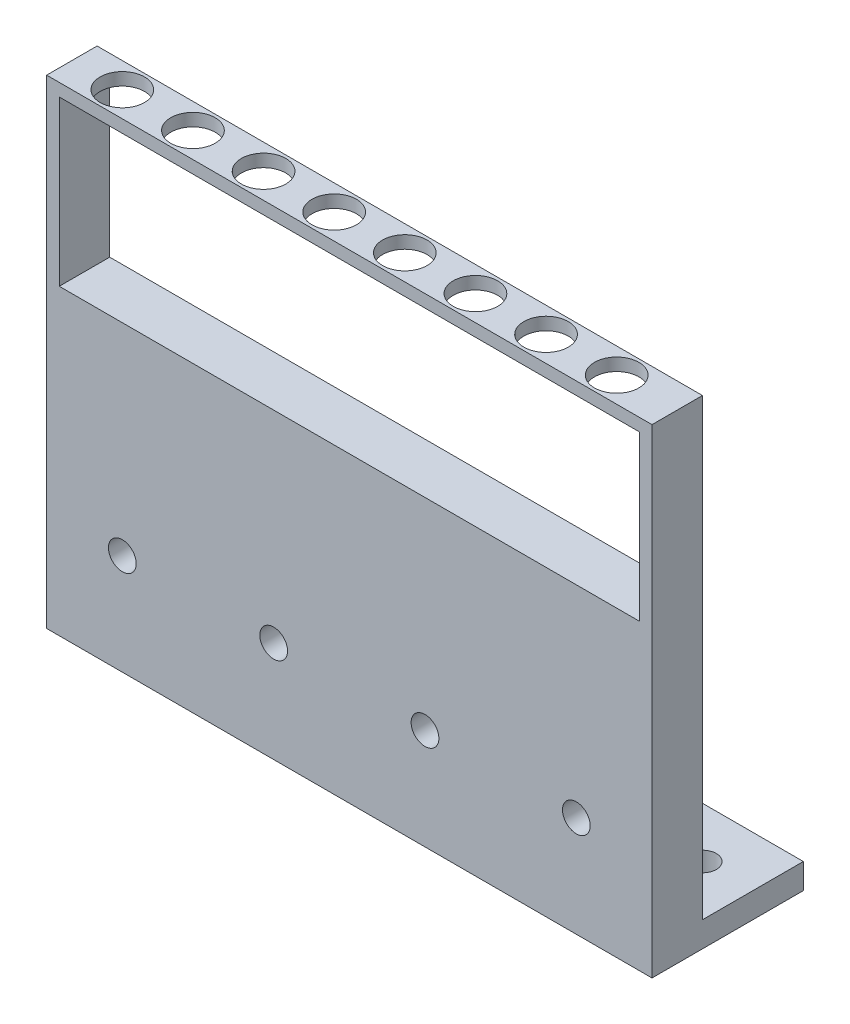
ISO-10303-21;
HEADER;
FILE_DESCRIPTION(('STEP AP214'),'2;1');
FILE_NAME('part.step','',(''),(''),'','','');
FILE_SCHEMA(('AUTOMOTIVE_DESIGN { 1 0 10303 214 1 1 1 1 }'));
ENDSEC;
DATA;
#1=APPLICATION_CONTEXT('core data for automotive mechanical design processes');
#2=APPLICATION_PROTOCOL_DEFINITION('international standard','automotive_design',2000,#1);
#3=PRODUCT_CONTEXT('',#1,'mechanical');
#4=PRODUCT('Part','Part','',(#3));
#5=PRODUCT_RELATED_PRODUCT_CATEGORY('part','',(#4));
#6=PRODUCT_DEFINITION_FORMATION('','',#4);
#7=PRODUCT_DEFINITION_CONTEXT('part definition',#1,'design');
#8=PRODUCT_DEFINITION('design','',#6,#7);
#9=PRODUCT_DEFINITION_SHAPE('','',#8);
#10=(LENGTH_UNIT() NAMED_UNIT(*) SI_UNIT(.MILLI.,.METRE.));
#11=(NAMED_UNIT(*) PLANE_ANGLE_UNIT() SI_UNIT($,.RADIAN.));
#12=(NAMED_UNIT(*) SI_UNIT($,.STERADIAN.) SOLID_ANGLE_UNIT());
#13=UNCERTAINTY_MEASURE_WITH_UNIT(LENGTH_MEASURE(1.E-05),#10,'distance_accuracy_value','');
#14=(GEOMETRIC_REPRESENTATION_CONTEXT(3) GLOBAL_UNCERTAINTY_ASSIGNED_CONTEXT((#13)) GLOBAL_UNIT_ASSIGNED_CONTEXT((#10,
#11,#12)) REPRESENTATION_CONTEXT('',''));
#15=CARTESIAN_POINT('',(0.,0.,0.));
#16=DIRECTION('',(0.,0.,1.));
#17=DIRECTION('',(1.,0.,0.));
#18=AXIS2_PLACEMENT_3D('',#15,#16,#17);
#19=CARTESIAN_POINT('',(-76.2,76.2,-6.35));
#20=DIRECTION('',(0.,0.,1.));
#21=DIRECTION('',(1.,0.,0.));
#22=AXIS2_PLACEMENT_3D('',#19,#20,#21);
#23=PLANE('',#22);
#24=CARTESIAN_POINT('',(19.05,25.4,-6.35));
#25=DIRECTION('',(0.,0.,-1.));
#26=DIRECTION('',(-1.,0.,0.));
#27=AXIS2_PLACEMENT_3D('',#24,#25,#26);
#28=CIRCLE('',#27,3.49250000000001);
#29=CARTESIAN_POINT('',(15.5575,25.4,-6.35));
#30=VERTEX_POINT('',#29);
#31=EDGE_CURVE('E321',#30,#30,#28,.T.);
#32=ORIENTED_EDGE('',*,*,#31,.F.);
#33=EDGE_LOOP('',(#32));
#34=FACE_BOUND('',#33,.T.);
#35=CARTESIAN_POINT('',(-19.05,25.4,-6.35));
#36=DIRECTION('',(0.,0.,-1.));
#37=DIRECTION('',(-1.,0.,0.));
#38=AXIS2_PLACEMENT_3D('',#35,#36,#37);
#39=CIRCLE('',#38,3.49250000000001);
#40=CARTESIAN_POINT('',(-22.5425,25.4,-6.35));
#41=VERTEX_POINT('',#40);
#42=EDGE_CURVE('E315',#41,#41,#39,.T.);
#43=ORIENTED_EDGE('',*,*,#42,.F.);
#44=EDGE_LOOP('',(#43));
#45=FACE_BOUND('',#44,.T.);
#46=CARTESIAN_POINT('',(-57.15,25.4,-6.35));
#47=DIRECTION('',(0.,0.,-1.));
#48=DIRECTION('',(-1.,0.,0.));
#49=AXIS2_PLACEMENT_3D('',#46,#47,#48);
#50=CIRCLE('',#49,3.49250000000001);
#51=CARTESIAN_POINT('',(-60.6425,25.4,-6.35));
#52=VERTEX_POINT('',#51);
#53=EDGE_CURVE('E309',#52,#52,#50,.T.);
#54=ORIENTED_EDGE('',*,*,#53,.F.);
#55=EDGE_LOOP('',(#54));
#56=FACE_BOUND('',#55,.T.);
#57=CARTESIAN_POINT('',(57.15,25.4,-6.35));
#58=DIRECTION('',(0.,0.,-1.));
#59=DIRECTION('',(-1.,0.,0.));
#60=AXIS2_PLACEMENT_3D('',#57,#58,#59);
#61=CIRCLE('',#60,3.49250000000001);
#62=CARTESIAN_POINT('',(53.6575,25.4,-6.35));
#63=VERTEX_POINT('',#62);
#64=EDGE_CURVE('E303',#63,#63,#61,.T.);
#65=ORIENTED_EDGE('',*,*,#64,.F.);
#66=EDGE_LOOP('',(#65));
#67=FACE_BOUND('',#66,.T.);
#68=DIRECTION('',(-1.,0.,0.));
#69=VECTOR('',#68,1.);
#70=CARTESIAN_POINT('',(-76.2,76.2,-6.35));
#71=LINE('',#70,#69);
#72=CARTESIAN_POINT('',(73.025,76.2,-6.34999999999999));
#73=VERTEX_POINT('',#72);
#74=CARTESIAN_POINT('',(-73.025,76.2,-6.35));
#75=VERTEX_POINT('',#74);
#76=EDGE_CURVE('E212',#73,#75,#71,.T.);
#77=ORIENTED_EDGE('',*,*,#76,.F.);
#78=DIRECTION('',(0.,1.,0.));
#79=VECTOR('',#78,1.);
#80=CARTESIAN_POINT('',(73.025,76.2,-6.34999999999999));
#81=LINE('',#80,#79);
#82=CARTESIAN_POINT('',(73.025,117.475,-6.34999999999999));
#83=VERTEX_POINT('',#82);
#84=EDGE_CURVE('E253',#73,#83,#81,.T.);
#85=ORIENTED_EDGE('',*,*,#84,.T.);
#86=DIRECTION('',(-1.,0.,0.));
#87=VECTOR('',#86,1.);
#88=CARTESIAN_POINT('',(73.025,117.475,-6.34999999999999));
#89=LINE('',#88,#87);
#90=CARTESIAN_POINT('',(-73.025,117.475,-6.34999999999999));
#91=VERTEX_POINT('',#90);
#92=EDGE_CURVE('E147',#83,#91,#89,.T.);
#93=ORIENTED_EDGE('',*,*,#92,.T.);
#94=DIRECTION('',(0.,-1.,0.));
#95=VECTOR('',#94,1.);
#96=CARTESIAN_POINT('',(-73.025,117.475,-6.34999999999999));
#97=LINE('',#96,#95);
#98=EDGE_CURVE('E115',#91,#75,#97,.T.);
#99=ORIENTED_EDGE('',*,*,#98,.T.);
#100=EDGE_LOOP('',(#77,#85,#93,#99));
#101=FACE_BOUND('',#100,.T.);
#102=DIRECTION('',(1.,0.,0.));
#103=VECTOR('',#102,1.);
#104=CARTESIAN_POINT('',(-76.2,6.35,-6.35));
#105=LINE('',#104,#103);
#106=CARTESIAN_POINT('',(-76.2,6.35000000000002,-6.35));
#107=VERTEX_POINT('',#106);
#108=CARTESIAN_POINT('',(76.2,6.35,-6.35));
#109=VERTEX_POINT('',#108);
#110=EDGE_CURVE('E196',#107,#109,#105,.T.);
#111=ORIENTED_EDGE('',*,*,#110,.F.);
#112=DIRECTION('',(0.,-1.,0.));
#113=VECTOR('',#112,1.);
#114=CARTESIAN_POINT('',(-76.2,76.2,-6.35));
#115=LINE('',#114,#113);
#116=CARTESIAN_POINT('',(-76.2,120.65,-6.34999999999999));
#117=VERTEX_POINT('',#116);
#118=EDGE_CURVE('E41',#117,#107,#115,.T.);
#119=ORIENTED_EDGE('',*,*,#118,.F.);
#120=DIRECTION('',(1.,0.,0.));
#121=VECTOR('',#120,1.);
#122=CARTESIAN_POINT('',(-76.2,120.65,-6.34999999999999));
#123=LINE('',#122,#121);
#124=CARTESIAN_POINT('',(76.2,120.65,-6.34999999999999));
#125=VERTEX_POINT('',#124);
#126=EDGE_CURVE('E137',#117,#125,#123,.T.);
#127=ORIENTED_EDGE('',*,*,#126,.T.);
#128=DIRECTION('',(0.,-1.,0.));
#129=VECTOR('',#128,1.);
#130=CARTESIAN_POINT('',(76.2,76.2,-6.35));
#131=LINE('',#130,#129);
#132=EDGE_CURVE('E11',#125,#109,#131,.T.);
#133=ORIENTED_EDGE('',*,*,#132,.T.);
#134=EDGE_LOOP('',(#111,#119,#127,#133));
#135=FACE_BOUND('',#134,.T.);
#136=ADVANCED_FACE('F33',(#34,#45,#56,#67,#101,#135),#23,.F.);
#137=CARTESIAN_POINT('',(76.2,76.2,6.35));
#138=DIRECTION('',(-1.,0.,0.));
#139=DIRECTION('',(0.,0.,1.));
#140=AXIS2_PLACEMENT_3D('',#137,#138,#139);
#141=PLANE('',#140);
#142=DIRECTION('',(0.,0.,-1.));
#143=VECTOR('',#142,1.);
#144=CARTESIAN_POINT('',(76.2,0.,6.35));
#145=LINE('',#144,#143);
#146=CARTESIAN_POINT('',(76.2,0.,6.35));
#147=VERTEX_POINT('',#146);
#148=CARTESIAN_POINT('',(76.2,0.,-31.75));
#149=VERTEX_POINT('',#148);
#150=EDGE_CURVE('E211',#147,#149,#145,.T.);
#151=ORIENTED_EDGE('',*,*,#150,.T.);
#152=DIRECTION('',(0.,-1.,0.));
#153=VECTOR('',#152,1.);
#154=CARTESIAN_POINT('',(76.2,6.35,-31.75));
#155=LINE('',#154,#153);
#156=CARTESIAN_POINT('',(76.2,6.35,-31.75));
#157=VERTEX_POINT('',#156);
#158=EDGE_CURVE('E208',#157,#149,#155,.T.);
#159=ORIENTED_EDGE('',*,*,#158,.F.);
#160=DIRECTION('',(0.,0.,-1.));
#161=VECTOR('',#160,1.);
#162=CARTESIAN_POINT('',(76.2,6.35,-6.35));
#163=LINE('',#162,#161);
#164=EDGE_CURVE('E199',#109,#157,#163,.T.);
#165=ORIENTED_EDGE('',*,*,#164,.F.);
#166=ORIENTED_EDGE('',*,*,#132,.F.);
#167=DIRECTION('',(0.,0.,1.));
#168=VECTOR('',#167,1.);
#169=CARTESIAN_POINT('',(76.2,120.65,-165.1));
#170=LINE('',#169,#168);
#171=CARTESIAN_POINT('',(76.2,120.65,6.35));
#172=VERTEX_POINT('',#171);
#173=EDGE_CURVE('E148',#125,#172,#170,.T.);
#174=ORIENTED_EDGE('',*,*,#173,.T.);
#175=DIRECTION('',(0.,-1.,0.));
#176=VECTOR('',#175,1.);
#177=CARTESIAN_POINT('',(76.2,76.2,6.35));
#178=LINE('',#177,#176);
#179=EDGE_CURVE('E216',#172,#147,#178,.T.);
#180=ORIENTED_EDGE('',*,*,#179,.T.);
#181=EDGE_LOOP('',(#151,#159,#165,#166,#174,#180));
#182=FACE_BOUND('',#181,.T.);
#183=ADVANCED_FACE('F35',(#182),#141,.F.);
#184=CARTESIAN_POINT('',(-76.2,76.2,6.35));
#185=DIRECTION('',(1.,0.,0.));
#186=DIRECTION('',(0.,0.,-1.));
#187=AXIS2_PLACEMENT_3D('',#184,#185,#186);
#188=PLANE('',#187);
#189=DIRECTION('',(0.,0.,1.));
#190=VECTOR('',#189,1.);
#191=CARTESIAN_POINT('',(-76.2,0.,6.35));
#192=LINE('',#191,#190);
#193=CARTESIAN_POINT('',(-76.2,0.,-31.75));
#194=VERTEX_POINT('',#193);
#195=CARTESIAN_POINT('',(-76.2,0.,6.35));
#196=VERTEX_POINT('',#195);
#197=EDGE_CURVE('E218',#194,#196,#192,.T.);
#198=ORIENTED_EDGE('',*,*,#197,.T.);
#199=DIRECTION('',(0.,-1.,0.));
#200=VECTOR('',#199,1.);
#201=CARTESIAN_POINT('',(-76.2,76.2,6.35));
#202=LINE('',#201,#200);
#203=CARTESIAN_POINT('',(-76.2,120.65,6.35));
#204=VERTEX_POINT('',#203);
#205=EDGE_CURVE('E223',#204,#196,#202,.T.);
#206=ORIENTED_EDGE('',*,*,#205,.F.);
#207=DIRECTION('',(0.,0.,1.));
#208=VECTOR('',#207,1.);
#209=CARTESIAN_POINT('',(-76.2,120.65,-165.1));
#210=LINE('',#209,#208);
#211=EDGE_CURVE('E144',#117,#204,#210,.T.);
#212=ORIENTED_EDGE('',*,*,#211,.F.);
#213=ORIENTED_EDGE('',*,*,#118,.T.);
#214=DIRECTION('',(0.,0.,1.));
#215=VECTOR('',#214,1.);
#216=CARTESIAN_POINT('',(-76.2,6.35,-19.05));
#217=LINE('',#216,#215);
#218=CARTESIAN_POINT('',(-76.2,6.35,-31.75));
#219=VERTEX_POINT('',#218);
#220=EDGE_CURVE('E193',#219,#107,#217,.T.);
#221=ORIENTED_EDGE('',*,*,#220,.F.);
#222=DIRECTION('',(0.,-1.,0.));
#223=VECTOR('',#222,1.);
#224=CARTESIAN_POINT('',(-76.2,6.35,-31.75));
#225=LINE('',#224,#223);
#226=EDGE_CURVE('E203',#219,#194,#225,.T.);
#227=ORIENTED_EDGE('',*,*,#226,.T.);
#228=EDGE_LOOP('',(#198,#206,#212,#213,#221,#227));
#229=FACE_BOUND('',#228,.T.);
#230=ADVANCED_FACE('F229',(#229),#188,.F.);
#231=CARTESIAN_POINT('',(-76.2,76.2,6.35));
#232=DIRECTION('',(0.,0.,-1.));
#233=DIRECTION('',(-1.,0.,0.));
#234=AXIS2_PLACEMENT_3D('',#231,#232,#233);
#235=PLANE('',#234);
#236=CARTESIAN_POINT('',(19.05,25.4,6.35));
#237=DIRECTION('',(0.,0.,-1.));
#238=DIRECTION('',(-1.,0.,0.));
#239=AXIS2_PLACEMENT_3D('',#236,#237,#238);
#240=CIRCLE('',#239,3.49250000000001);
#241=CARTESIAN_POINT('',(15.5575,25.4,6.35));
#242=VERTEX_POINT('',#241);
#243=EDGE_CURVE('E306',#242,#242,#240,.T.);
#244=ORIENTED_EDGE('',*,*,#243,.T.);
#245=EDGE_LOOP('',(#244));
#246=FACE_BOUND('',#245,.T.);
#247=CARTESIAN_POINT('',(-19.05,25.4,6.35));
#248=DIRECTION('',(0.,0.,-1.));
#249=DIRECTION('',(-1.,0.,0.));
#250=AXIS2_PLACEMENT_3D('',#247,#248,#249);
#251=CIRCLE('',#250,3.49250000000001);
#252=CARTESIAN_POINT('',(-22.5425,25.4,6.35));
#253=VERTEX_POINT('',#252);
#254=EDGE_CURVE('E318',#253,#253,#251,.T.);
#255=ORIENTED_EDGE('',*,*,#254,.T.);
#256=EDGE_LOOP('',(#255));
#257=FACE_BOUND('',#256,.T.);
#258=CARTESIAN_POINT('',(-57.15,25.4,6.35));
#259=DIRECTION('',(0.,0.,-1.));
#260=DIRECTION('',(-1.,0.,0.));
#261=AXIS2_PLACEMENT_3D('',#258,#259,#260);
#262=CIRCLE('',#261,3.49250000000001);
#263=CARTESIAN_POINT('',(-60.6425,25.4,6.35));
#264=VERTEX_POINT('',#263);
#265=EDGE_CURVE('E312',#264,#264,#262,.T.);
#266=ORIENTED_EDGE('',*,*,#265,.T.);
#267=EDGE_LOOP('',(#266));
#268=FACE_BOUND('',#267,.T.);
#269=CARTESIAN_POINT('',(57.15,25.4,6.35));
#270=DIRECTION('',(0.,0.,-1.));
#271=DIRECTION('',(-1.,0.,0.));
#272=AXIS2_PLACEMENT_3D('',#269,#270,#271);
#273=CIRCLE('',#272,3.49250000000001);
#274=CARTESIAN_POINT('',(53.6575,25.4,6.35));
#275=VERTEX_POINT('',#274);
#276=EDGE_CURVE('E265',#275,#275,#273,.T.);
#277=ORIENTED_EDGE('',*,*,#276,.T.);
#278=EDGE_LOOP('',(#277));
#279=FACE_BOUND('',#278,.T.);
#280=DIRECTION('',(1.,0.,0.));
#281=VECTOR('',#280,1.);
#282=CARTESIAN_POINT('',(-76.2,76.2,6.35));
#283=LINE('',#282,#281);
#284=CARTESIAN_POINT('',(-73.025,76.2,6.35));
#285=VERTEX_POINT('',#284);
#286=CARTESIAN_POINT('',(73.025,76.2,6.35));
#287=VERTEX_POINT('',#286);
#288=EDGE_CURVE('E48',#285,#287,#283,.T.);
#289=ORIENTED_EDGE('',*,*,#288,.F.);
#290=DIRECTION('',(0.,1.,0.));
#291=VECTOR('',#290,1.);
#292=CARTESIAN_POINT('',(-73.025,117.475,6.35));
#293=LINE('',#292,#291);
#294=CARTESIAN_POINT('',(-73.025,117.475,6.35));
#295=VERTEX_POINT('',#294);
#296=EDGE_CURVE('E113',#285,#295,#293,.T.);
#297=ORIENTED_EDGE('',*,*,#296,.T.);
#298=DIRECTION('',(1.,0.,0.));
#299=VECTOR('',#298,1.);
#300=CARTESIAN_POINT('',(73.025,117.475,6.35));
#301=LINE('',#300,#299);
#302=CARTESIAN_POINT('',(73.025,117.475,6.35));
#303=VERTEX_POINT('',#302);
#304=EDGE_CURVE('E121',#295,#303,#301,.T.);
#305=ORIENTED_EDGE('',*,*,#304,.T.);
#306=DIRECTION('',(0.,-1.,0.));
#307=VECTOR('',#306,1.);
#308=CARTESIAN_POINT('',(73.025,76.2,6.35));
#309=LINE('',#308,#307);
#310=EDGE_CURVE('E127',#303,#287,#309,.T.);
#311=ORIENTED_EDGE('',*,*,#310,.T.);
#312=EDGE_LOOP('',(#289,#297,#305,#311));
#313=FACE_BOUND('',#312,.T.);
#314=DIRECTION('',(1.,0.,0.));
#315=VECTOR('',#314,1.);
#316=CARTESIAN_POINT('',(-76.2,0.,6.35));
#317=LINE('',#316,#315);
#318=EDGE_CURVE('E214',#196,#147,#317,.T.);
#319=ORIENTED_EDGE('',*,*,#318,.T.);
#320=ORIENTED_EDGE('',*,*,#179,.F.);
#321=DIRECTION('',(-1.,0.,0.));
#322=VECTOR('',#321,1.);
#323=CARTESIAN_POINT('',(-76.2,120.65,6.35));
#324=LINE('',#323,#322);
#325=EDGE_CURVE('E141',#172,#204,#324,.T.);
#326=ORIENTED_EDGE('',*,*,#325,.T.);
#327=ORIENTED_EDGE('',*,*,#205,.T.);
#328=EDGE_LOOP('',(#319,#320,#326,#327));
#329=FACE_BOUND('',#328,.T.);
#330=ADVANCED_FACE('F129',(#246,#257,#268,#279,#313,#329),#235,.F.);
#331=CARTESIAN_POINT('',(0.,76.2,0.));
#332=DIRECTION('',(0.,-1.,0.));
#333=DIRECTION('',(0.,0.,-1.));
#334=AXIS2_PLACEMENT_3D('',#331,#332,#333);
#335=PLANE('',#334);
#336=ORIENTED_EDGE('',*,*,#288,.T.);
#337=DIRECTION('',(0.,0.,1.));
#338=VECTOR('',#337,1.);
#339=CARTESIAN_POINT('',(73.025,76.2,-165.1));
#340=LINE('',#339,#338);
#341=EDGE_CURVE('E151',#73,#287,#340,.T.);
#342=ORIENTED_EDGE('',*,*,#341,.F.);
#343=ORIENTED_EDGE('',*,*,#76,.T.);
#344=DIRECTION('',(0.,0.,1.));
#345=VECTOR('',#344,1.);
#346=CARTESIAN_POINT('',(-73.025,76.2,-165.1));
#347=LINE('',#346,#345);
#348=EDGE_CURVE('E53',#75,#285,#347,.T.);
#349=ORIENTED_EDGE('',*,*,#348,.T.);
#350=EDGE_LOOP('',(#336,#342,#343,#349));
#351=FACE_BOUND('',#350,.T.);
#352=ADVANCED_FACE('F343',(#351),#335,.F.);
#353=CARTESIAN_POINT('',(0.,0.,0.));
#354=DIRECTION('',(0.,-1.,0.));
#355=DIRECTION('',(0.,0.,-1.));
#356=AXIS2_PLACEMENT_3D('',#353,#354,#355);
#357=PLANE('',#356);
#358=ORIENTED_EDGE('',*,*,#150,.F.);
#359=ORIENTED_EDGE('',*,*,#318,.F.);
#360=ORIENTED_EDGE('',*,*,#197,.F.);
#361=DIRECTION('',(-1.,0.,0.));
#362=VECTOR('',#361,1.);
#363=CARTESIAN_POINT('',(76.2,0.,-31.75));
#364=LINE('',#363,#362);
#365=EDGE_CURVE('E190',#149,#194,#364,.T.);
#366=ORIENTED_EDGE('',*,*,#365,.F.);
#367=EDGE_LOOP('',(#358,#359,#360,#366));
#368=FACE_BOUND('',#367,.T.);
#369=CARTESIAN_POINT('',(-63.5,0.,-19.05));
#370=DIRECTION('',(0.,1.,0.));
#371=DIRECTION('',(0.,0.,1.));
#372=AXIS2_PLACEMENT_3D('',#369,#370,#371);
#373=CIRCLE('',#372,3.4925);
#374=CARTESIAN_POINT('',(-63.5,0.,-15.5575));
#375=VERTEX_POINT('',#374);
#376=EDGE_CURVE('E184',#375,#375,#373,.T.);
#377=ORIENTED_EDGE('',*,*,#376,.T.);
#378=EDGE_LOOP('',(#377));
#379=FACE_BOUND('',#378,.T.);
#380=CARTESIAN_POINT('',(-38.1,0.,-19.05));
#381=DIRECTION('',(0.,1.,0.));
#382=DIRECTION('',(0.,0.,1.));
#383=AXIS2_PLACEMENT_3D('',#380,#381,#382);
#384=CIRCLE('',#383,3.49250000000001);
#385=CARTESIAN_POINT('',(-38.1,0.,-15.5575));
#386=VERTEX_POINT('',#385);
#387=EDGE_CURVE('E178',#386,#386,#384,.T.);
#388=ORIENTED_EDGE('',*,*,#387,.T.);
#389=EDGE_LOOP('',(#388));
#390=FACE_BOUND('',#389,.T.);
#391=CARTESIAN_POINT('',(-12.7,0.,-19.05));
#392=DIRECTION('',(0.,1.,0.));
#393=DIRECTION('',(0.,0.,1.));
#394=AXIS2_PLACEMENT_3D('',#391,#392,#393);
#395=CIRCLE('',#394,3.4925);
#396=CARTESIAN_POINT('',(-12.7,0.,-15.5575));
#397=VERTEX_POINT('',#396);
#398=EDGE_CURVE('E172',#397,#397,#395,.T.);
#399=ORIENTED_EDGE('',*,*,#398,.T.);
#400=EDGE_LOOP('',(#399));
#401=FACE_BOUND('',#400,.T.);
#402=CARTESIAN_POINT('',(12.6999999999999,0.,-19.05));
#403=DIRECTION('',(0.,1.,0.));
#404=DIRECTION('',(0.,0.,1.));
#405=AXIS2_PLACEMENT_3D('',#402,#403,#404);
#406=CIRCLE('',#405,3.4925);
#407=CARTESIAN_POINT('',(12.6999999999999,0.,-15.5575));
#408=VERTEX_POINT('',#407);
#409=EDGE_CURVE('E166',#408,#408,#406,.T.);
#410=ORIENTED_EDGE('',*,*,#409,.T.);
#411=EDGE_LOOP('',(#410));
#412=FACE_BOUND('',#411,.T.);
#413=CARTESIAN_POINT('',(38.0999999999999,0.,-19.05));
#414=DIRECTION('',(0.,1.,0.));
#415=DIRECTION('',(0.,0.,1.));
#416=AXIS2_PLACEMENT_3D('',#413,#414,#415);
#417=CIRCLE('',#416,3.49250000000001);
#418=CARTESIAN_POINT('',(38.0999999999999,0.,-15.5575));
#419=VERTEX_POINT('',#418);
#420=EDGE_CURVE('E160',#419,#419,#417,.T.);
#421=ORIENTED_EDGE('',*,*,#420,.T.);
#422=EDGE_LOOP('',(#421));
#423=FACE_BOUND('',#422,.T.);
#424=CARTESIAN_POINT('',(63.4999999999999,0.,-19.05));
#425=DIRECTION('',(0.,1.,0.));
#426=DIRECTION('',(0.,0.,1.));
#427=AXIS2_PLACEMENT_3D('',#424,#425,#426);
#428=CIRCLE('',#427,3.49250000000001);
#429=CARTESIAN_POINT('',(63.4999999999999,0.,-15.5575));
#430=VERTEX_POINT('',#429);
#431=EDGE_CURVE('E156',#430,#430,#428,.T.);
#432=ORIENTED_EDGE('',*,*,#431,.T.);
#433=EDGE_LOOP('',(#432));
#434=FACE_BOUND('',#433,.T.);
#435=ADVANCED_FACE('F247',(#368,#379,#390,#401,#412,#423,#434),#357,.T.);
#436=CARTESIAN_POINT('',(0.,6.35,0.));
#437=DIRECTION('',(0.,1.,0.));
#438=DIRECTION('',(0.,0.,1.));
#439=AXIS2_PLACEMENT_3D('',#436,#437,#438);
#440=PLANE('',#439);
#441=CARTESIAN_POINT('',(38.0999999999999,6.35,-19.05));
#442=DIRECTION('',(0.,1.,0.));
#443=DIRECTION('',(0.,0.,1.));
#444=AXIS2_PLACEMENT_3D('',#441,#442,#443);
#445=CIRCLE('',#444,3.49250000000001);
#446=CARTESIAN_POINT('',(38.0999999999999,6.35,-15.5575));
#447=VERTEX_POINT('',#446);
#448=EDGE_CURVE('E163',#447,#447,#445,.T.);
#449=ORIENTED_EDGE('',*,*,#448,.F.);
#450=EDGE_LOOP('',(#449));
#451=FACE_BOUND('',#450,.T.);
#452=CARTESIAN_POINT('',(-12.7,6.35,-19.05));
#453=DIRECTION('',(0.,1.,0.));
#454=DIRECTION('',(0.,0.,1.));
#455=AXIS2_PLACEMENT_3D('',#452,#453,#454);
#456=CIRCLE('',#455,3.4925);
#457=CARTESIAN_POINT('',(-12.7,6.35,-15.5575));
#458=VERTEX_POINT('',#457);
#459=EDGE_CURVE('E175',#458,#458,#456,.T.);
#460=ORIENTED_EDGE('',*,*,#459,.F.);
#461=EDGE_LOOP('',(#460));
#462=FACE_BOUND('',#461,.T.);
#463=CARTESIAN_POINT('',(-63.5,6.35,-19.05));
#464=DIRECTION('',(0.,1.,0.));
#465=DIRECTION('',(0.,0.,1.));
#466=AXIS2_PLACEMENT_3D('',#463,#464,#465);
#467=CIRCLE('',#466,3.4925);
#468=CARTESIAN_POINT('',(-63.5,6.35,-15.5575));
#469=VERTEX_POINT('',#468);
#470=EDGE_CURVE('E187',#469,#469,#467,.T.);
#471=ORIENTED_EDGE('',*,*,#470,.F.);
#472=EDGE_LOOP('',(#471));
#473=FACE_BOUND('',#472,.T.);
#474=ORIENTED_EDGE('',*,*,#220,.T.);
#475=ORIENTED_EDGE('',*,*,#110,.T.);
#476=ORIENTED_EDGE('',*,*,#164,.T.);
#477=DIRECTION('',(-1.,0.,0.));
#478=VECTOR('',#477,1.);
#479=CARTESIAN_POINT('',(76.2,6.35,-31.75));
#480=LINE('',#479,#478);
#481=EDGE_CURVE('E201',#157,#219,#480,.T.);
#482=ORIENTED_EDGE('',*,*,#481,.T.);
#483=EDGE_LOOP('',(#474,#475,#476,#482));
#484=FACE_BOUND('',#483,.T.);
#485=CARTESIAN_POINT('',(-38.1,6.35,-19.05));
#486=DIRECTION('',(0.,1.,0.));
#487=DIRECTION('',(0.,0.,1.));
#488=AXIS2_PLACEMENT_3D('',#485,#486,#487);
#489=CIRCLE('',#488,3.49250000000001);
#490=CARTESIAN_POINT('',(-38.1,6.35,-15.5575));
#491=VERTEX_POINT('',#490);
#492=EDGE_CURVE('E181',#491,#491,#489,.T.);
#493=ORIENTED_EDGE('',*,*,#492,.F.);
#494=EDGE_LOOP('',(#493));
#495=FACE_BOUND('',#494,.T.);
#496=CARTESIAN_POINT('',(12.6999999999999,6.35,-19.05));
#497=DIRECTION('',(0.,1.,0.));
#498=DIRECTION('',(0.,0.,1.));
#499=AXIS2_PLACEMENT_3D('',#496,#497,#498);
#500=CIRCLE('',#499,3.4925);
#501=CARTESIAN_POINT('',(12.6999999999999,6.35,-15.5575));
#502=VERTEX_POINT('',#501);
#503=EDGE_CURVE('E169',#502,#502,#500,.T.);
#504=ORIENTED_EDGE('',*,*,#503,.F.);
#505=EDGE_LOOP('',(#504));
#506=FACE_BOUND('',#505,.T.);
#507=CARTESIAN_POINT('',(63.4999999999999,6.35,-19.05));
#508=DIRECTION('',(0.,1.,0.));
#509=DIRECTION('',(0.,0.,1.));
#510=AXIS2_PLACEMENT_3D('',#507,#508,#509);
#511=CIRCLE('',#510,3.49250000000001);
#512=CARTESIAN_POINT('',(63.4999999999999,6.35,-15.5575));
#513=VERTEX_POINT('',#512);
#514=EDGE_CURVE('E157',#513,#513,#511,.T.);
#515=ORIENTED_EDGE('',*,*,#514,.F.);
#516=EDGE_LOOP('',(#515));
#517=FACE_BOUND('',#516,.T.);
#518=ADVANCED_FACE('F234',(#451,#462,#473,#484,#495,#506,#517),#440,.T.);
#519=CARTESIAN_POINT('',(76.2,6.35,-31.75));
#520=DIRECTION('',(0.,0.,1.));
#521=DIRECTION('',(1.,0.,0.));
#522=AXIS2_PLACEMENT_3D('',#519,#520,#521);
#523=PLANE('',#522);
#524=ORIENTED_EDGE('',*,*,#365,.T.);
#525=ORIENTED_EDGE('',*,*,#226,.F.);
#526=ORIENTED_EDGE('',*,*,#481,.F.);
#527=ORIENTED_EDGE('',*,*,#158,.T.);
#528=EDGE_LOOP('',(#524,#525,#526,#527));
#529=FACE_BOUND('',#528,.T.);
#530=ADVANCED_FACE('F241',(#529),#523,.F.);
#531=CARTESIAN_POINT('',(-63.5,6.35,-19.05));
#532=DIRECTION('',(0.,-1.,0.));
#533=DIRECTION('',(0.,0.,-1.));
#534=AXIS2_PLACEMENT_3D('',#531,#532,#533);
#535=CYLINDRICAL_SURFACE('',#534,3.4925);
#536=ORIENTED_EDGE('',*,*,#470,.T.);
#537=EDGE_LOOP('',(#536));
#538=FACE_BOUND('',#537,.T.);
#539=ORIENTED_EDGE('',*,*,#376,.F.);
#540=EDGE_LOOP('',(#539));
#541=FACE_BOUND('',#540,.T.);
#542=ADVANCED_FACE('F380',(#538,#541),#535,.F.);
#543=CARTESIAN_POINT('',(-38.1,6.35,-19.05));
#544=DIRECTION('',(0.,-1.,0.));
#545=DIRECTION('',(0.,0.,-1.));
#546=AXIS2_PLACEMENT_3D('',#543,#544,#545);
#547=CYLINDRICAL_SURFACE('',#546,3.49250000000001);
#548=ORIENTED_EDGE('',*,*,#492,.T.);
#549=EDGE_LOOP('',(#548));
#550=FACE_BOUND('',#549,.T.);
#551=ORIENTED_EDGE('',*,*,#387,.F.);
#552=EDGE_LOOP('',(#551));
#553=FACE_BOUND('',#552,.T.);
#554=ADVANCED_FACE('F376',(#550,#553),#547,.F.);
#555=CARTESIAN_POINT('',(-12.7,6.35,-19.05));
#556=DIRECTION('',(0.,-1.,0.));
#557=DIRECTION('',(0.,0.,-1.));
#558=AXIS2_PLACEMENT_3D('',#555,#556,#557);
#559=CYLINDRICAL_SURFACE('',#558,3.4925);
#560=ORIENTED_EDGE('',*,*,#459,.T.);
#561=EDGE_LOOP('',(#560));
#562=FACE_BOUND('',#561,.T.);
#563=ORIENTED_EDGE('',*,*,#398,.F.);
#564=EDGE_LOOP('',(#563));
#565=FACE_BOUND('',#564,.T.);
#566=ADVANCED_FACE('F372',(#562,#565),#559,.F.);
#567=CARTESIAN_POINT('',(12.6999999999999,6.35,-19.05));
#568=DIRECTION('',(0.,-1.,0.));
#569=DIRECTION('',(0.,0.,-1.));
#570=AXIS2_PLACEMENT_3D('',#567,#568,#569);
#571=CYLINDRICAL_SURFACE('',#570,3.4925);
#572=ORIENTED_EDGE('',*,*,#503,.T.);
#573=EDGE_LOOP('',(#572));
#574=FACE_BOUND('',#573,.T.);
#575=ORIENTED_EDGE('',*,*,#409,.F.);
#576=EDGE_LOOP('',(#575));
#577=FACE_BOUND('',#576,.T.);
#578=ADVANCED_FACE('F368',(#574,#577),#571,.F.);
#579=CARTESIAN_POINT('',(38.0999999999999,6.35,-19.05));
#580=DIRECTION('',(0.,-1.,0.));
#581=DIRECTION('',(0.,0.,-1.));
#582=AXIS2_PLACEMENT_3D('',#579,#580,#581);
#583=CYLINDRICAL_SURFACE('',#582,3.49250000000001);
#584=ORIENTED_EDGE('',*,*,#448,.T.);
#585=EDGE_LOOP('',(#584));
#586=FACE_BOUND('',#585,.T.);
#587=ORIENTED_EDGE('',*,*,#420,.F.);
#588=EDGE_LOOP('',(#587));
#589=FACE_BOUND('',#588,.T.);
#590=ADVANCED_FACE('F364',(#586,#589),#583,.F.);
#591=CARTESIAN_POINT('',(63.4999999999999,6.35,-19.05));
#592=DIRECTION('',(0.,-1.,0.));
#593=DIRECTION('',(0.,0.,-1.));
#594=AXIS2_PLACEMENT_3D('',#591,#592,#593);
#595=CYLINDRICAL_SURFACE('',#594,3.49250000000001);
#596=ORIENTED_EDGE('',*,*,#514,.T.);
#597=EDGE_LOOP('',(#596));
#598=FACE_BOUND('',#597,.T.);
#599=ORIENTED_EDGE('',*,*,#431,.F.);
#600=EDGE_LOOP('',(#599));
#601=FACE_BOUND('',#600,.T.);
#602=ADVANCED_FACE('F354',(#598,#601),#595,.F.);
#603=CARTESIAN_POINT('',(-76.2,120.65,-165.1));
#604=DIRECTION('',(0.,1.,0.));
#605=DIRECTION('',(0.,0.,1.));
#606=AXIS2_PLACEMENT_3D('',#603,#604,#605);
#607=PLANE('',#606);
#608=CARTESIAN_POINT('',(-45.72,120.65,0.));
#609=DIRECTION('',(0.,1.,0.));
#610=DIRECTION('',(0.,0.,1.));
#611=AXIS2_PLACEMENT_3D('',#608,#609,#610);
#612=CIRCLE('',#611,5.588);
#613=CARTESIAN_POINT('',(-45.72,120.65,5.588));
#614=VERTEX_POINT('',#613);
#615=EDGE_CURVE('E259',#614,#614,#612,.T.);
#616=ORIENTED_EDGE('',*,*,#615,.F.);
#617=EDGE_LOOP('',(#616));
#618=FACE_BOUND('',#617,.T.);
#619=CARTESIAN_POINT('',(-27.94,120.65,0.));
#620=DIRECTION('',(0.,1.,0.));
#621=DIRECTION('',(0.,0.,1.));
#622=AXIS2_PLACEMENT_3D('',#619,#620,#621);
#623=CIRCLE('',#622,5.588);
#624=CARTESIAN_POINT('',(-27.94,120.65,5.588));
#625=VERTEX_POINT('',#624);
#626=EDGE_CURVE('E295',#625,#625,#623,.T.);
#627=ORIENTED_EDGE('',*,*,#626,.F.);
#628=EDGE_LOOP('',(#627));
#629=FACE_BOUND('',#628,.T.);
#630=CARTESIAN_POINT('',(-10.16,120.65,0.));
#631=DIRECTION('',(0.,1.,0.));
#632=DIRECTION('',(0.,0.,1.));
#633=AXIS2_PLACEMENT_3D('',#630,#631,#632);
#634=CIRCLE('',#633,5.588);
#635=CARTESIAN_POINT('',(-10.16,120.65,5.588));
#636=VERTEX_POINT('',#635);
#637=EDGE_CURVE('E289',#636,#636,#634,.T.);
#638=ORIENTED_EDGE('',*,*,#637,.F.);
#639=EDGE_LOOP('',(#638));
#640=FACE_BOUND('',#639,.T.);
#641=CARTESIAN_POINT('',(7.61999999999997,120.65,0.));
#642=DIRECTION('',(0.,1.,0.));
#643=DIRECTION('',(0.,0.,1.));
#644=AXIS2_PLACEMENT_3D('',#641,#642,#643);
#645=CIRCLE('',#644,5.588);
#646=CARTESIAN_POINT('',(7.61999999999997,120.65,5.588));
#647=VERTEX_POINT('',#646);
#648=EDGE_CURVE('E283',#647,#647,#645,.T.);
#649=ORIENTED_EDGE('',*,*,#648,.F.);
#650=EDGE_LOOP('',(#649));
#651=FACE_BOUND('',#650,.T.);
#652=CARTESIAN_POINT('',(25.4,120.65,0.));
#653=DIRECTION('',(0.,1.,0.));
#654=DIRECTION('',(0.,0.,1.));
#655=AXIS2_PLACEMENT_3D('',#652,#653,#654);
#656=CIRCLE('',#655,5.588);
#657=CARTESIAN_POINT('',(25.4,120.65,5.588));
#658=VERTEX_POINT('',#657);
#659=EDGE_CURVE('E277',#658,#658,#656,.T.);
#660=ORIENTED_EDGE('',*,*,#659,.F.);
#661=EDGE_LOOP('',(#660));
#662=FACE_BOUND('',#661,.T.);
#663=CARTESIAN_POINT('',(43.18,120.65,0.));
#664=DIRECTION('',(0.,1.,0.));
#665=DIRECTION('',(0.,0.,1.));
#666=AXIS2_PLACEMENT_3D('',#663,#664,#665);
#667=CIRCLE('',#666,5.588);
#668=CARTESIAN_POINT('',(43.18,120.65,5.588));
#669=VERTEX_POINT('',#668);
#670=EDGE_CURVE('E271',#669,#669,#667,.T.);
#671=ORIENTED_EDGE('',*,*,#670,.F.);
#672=EDGE_LOOP('',(#671));
#673=FACE_BOUND('',#672,.T.);
#674=CARTESIAN_POINT('',(60.96,120.65,0.));
#675=DIRECTION('',(0.,1.,0.));
#676=DIRECTION('',(0.,0.,1.));
#677=AXIS2_PLACEMENT_3D('',#674,#675,#676);
#678=CIRCLE('',#677,5.58799999999999);
#679=CARTESIAN_POINT('',(60.96,120.65,5.58799999999999));
#680=VERTEX_POINT('',#679);
#681=EDGE_CURVE('E264',#680,#680,#678,.T.);
#682=ORIENTED_EDGE('',*,*,#681,.F.);
#683=EDGE_LOOP('',(#682));
#684=FACE_BOUND('',#683,.T.);
#685=CARTESIAN_POINT('',(-63.5,120.65,0.));
#686=DIRECTION('',(0.,1.,0.));
#687=DIRECTION('',(0.,0.,1.));
#688=AXIS2_PLACEMENT_3D('',#685,#686,#687);
#689=CIRCLE('',#688,5.588);
#690=CARTESIAN_POINT('',(-63.5,120.65,5.588));
#691=VERTEX_POINT('',#690);
#692=EDGE_CURVE('E131',#691,#691,#689,.T.);
#693=ORIENTED_EDGE('',*,*,#692,.F.);
#694=EDGE_LOOP('',(#693));
#695=FACE_BOUND('',#694,.T.);
#696=ORIENTED_EDGE('',*,*,#126,.F.);
#697=ORIENTED_EDGE('',*,*,#211,.T.);
#698=ORIENTED_EDGE('',*,*,#325,.F.);
#699=ORIENTED_EDGE('',*,*,#173,.F.);
#700=EDGE_LOOP('',(#696,#697,#698,#699));
#701=FACE_BOUND('',#700,.T.);
#702=ADVANCED_FACE('F252',(#618,#629,#640,#651,#662,#673,#684,#695,#701),#607,.T.);
#703=CARTESIAN_POINT('',(73.025,76.2,-165.1));
#704=DIRECTION('',(-1.,0.,0.));
#705=DIRECTION('',(0.,0.,1.));
#706=AXIS2_PLACEMENT_3D('',#703,#704,#705);
#707=PLANE('',#706);
#708=ORIENTED_EDGE('',*,*,#84,.F.);
#709=ORIENTED_EDGE('',*,*,#341,.T.);
#710=ORIENTED_EDGE('',*,*,#310,.F.);
#711=DIRECTION('',(0.,0.,1.));
#712=VECTOR('',#711,1.);
#713=CARTESIAN_POINT('',(73.025,117.475,-165.1));
#714=LINE('',#713,#712);
#715=EDGE_CURVE('E118',#83,#303,#714,.T.);
#716=ORIENTED_EDGE('',*,*,#715,.F.);
#717=EDGE_LOOP('',(#708,#709,#710,#716));
#718=FACE_BOUND('',#717,.T.);
#719=ADVANCED_FACE('F345',(#718),#707,.T.);
#720=CARTESIAN_POINT('',(73.025,117.475,-165.1));
#721=DIRECTION('',(0.,-1.,0.));
#722=DIRECTION('',(1.,0.,0.));
#723=AXIS2_PLACEMENT_3D('',#720,#721,#722);
#724=PLANE('',#723);
#725=CARTESIAN_POINT('',(-45.72,117.475,0.));
#726=DIRECTION('',(0.,-1.,0.));
#727=DIRECTION('',(1.,0.,0.));
#728=AXIS2_PLACEMENT_3D('',#725,#726,#727);
#729=CIRCLE('',#728,5.588);
#730=CARTESIAN_POINT('',(-40.132,117.475,0.));
#731=VERTEX_POINT('',#730);
#732=EDGE_CURVE('E298',#731,#731,#729,.F.);
#733=ORIENTED_EDGE('',*,*,#732,.T.);
#734=EDGE_LOOP('',(#733));
#735=FACE_BOUND('',#734,.T.);
#736=CARTESIAN_POINT('',(-27.94,117.475,0.));
#737=DIRECTION('',(0.,-1.,0.));
#738=DIRECTION('',(1.,0.,0.));
#739=AXIS2_PLACEMENT_3D('',#736,#737,#738);
#740=CIRCLE('',#739,5.588);
#741=CARTESIAN_POINT('',(-22.352,117.475,0.));
#742=VERTEX_POINT('',#741);
#743=EDGE_CURVE('E292',#742,#742,#740,.F.);
#744=ORIENTED_EDGE('',*,*,#743,.T.);
#745=EDGE_LOOP('',(#744));
#746=FACE_BOUND('',#745,.T.);
#747=CARTESIAN_POINT('',(-10.16,117.475,0.));
#748=DIRECTION('',(0.,-1.,0.));
#749=DIRECTION('',(1.,0.,0.));
#750=AXIS2_PLACEMENT_3D('',#747,#748,#749);
#751=CIRCLE('',#750,5.588);
#752=CARTESIAN_POINT('',(-4.57200000000002,117.475,0.));
#753=VERTEX_POINT('',#752);
#754=EDGE_CURVE('E286',#753,#753,#751,.F.);
#755=ORIENTED_EDGE('',*,*,#754,.T.);
#756=EDGE_LOOP('',(#755));
#757=FACE_BOUND('',#756,.T.);
#758=CARTESIAN_POINT('',(7.61999999999997,117.475,0.));
#759=DIRECTION('',(0.,-1.,0.));
#760=DIRECTION('',(1.,0.,0.));
#761=AXIS2_PLACEMENT_3D('',#758,#759,#760);
#762=CIRCLE('',#761,5.588);
#763=CARTESIAN_POINT('',(13.208,117.475,0.));
#764=VERTEX_POINT('',#763);
#765=EDGE_CURVE('E280',#764,#764,#762,.F.);
#766=ORIENTED_EDGE('',*,*,#765,.T.);
#767=EDGE_LOOP('',(#766));
#768=FACE_BOUND('',#767,.T.);
#769=CARTESIAN_POINT('',(25.4,117.475,0.));
#770=DIRECTION('',(0.,-1.,0.));
#771=DIRECTION('',(1.,0.,0.));
#772=AXIS2_PLACEMENT_3D('',#769,#770,#771);
#773=CIRCLE('',#772,5.588);
#774=CARTESIAN_POINT('',(30.988,117.475,0.));
#775=VERTEX_POINT('',#774);
#776=EDGE_CURVE('E274',#775,#775,#773,.F.);
#777=ORIENTED_EDGE('',*,*,#776,.T.);
#778=EDGE_LOOP('',(#777));
#779=FACE_BOUND('',#778,.T.);
#780=CARTESIAN_POINT('',(43.18,117.475,0.));
#781=DIRECTION('',(0.,-1.,0.));
#782=DIRECTION('',(1.,0.,0.));
#783=AXIS2_PLACEMENT_3D('',#780,#781,#782);
#784=CIRCLE('',#783,5.588);
#785=CARTESIAN_POINT('',(48.768,117.475,0.));
#786=VERTEX_POINT('',#785);
#787=EDGE_CURVE('E268',#786,#786,#784,.F.);
#788=ORIENTED_EDGE('',*,*,#787,.T.);
#789=EDGE_LOOP('',(#788));
#790=FACE_BOUND('',#789,.T.);
#791=CARTESIAN_POINT('',(60.96,117.475,0.));
#792=DIRECTION('',(0.,-1.,0.));
#793=DIRECTION('',(1.,0.,0.));
#794=AXIS2_PLACEMENT_3D('',#791,#792,#793);
#795=CIRCLE('',#794,5.58799999999999);
#796=CARTESIAN_POINT('',(66.548,117.475,0.));
#797=VERTEX_POINT('',#796);
#798=EDGE_CURVE('E261',#797,#797,#795,.F.);
#799=ORIENTED_EDGE('',*,*,#798,.T.);
#800=EDGE_LOOP('',(#799));
#801=FACE_BOUND('',#800,.T.);
#802=CARTESIAN_POINT('',(-63.5,117.475,0.));
#803=DIRECTION('',(0.,-1.,0.));
#804=DIRECTION('',(1.,0.,0.));
#805=AXIS2_PLACEMENT_3D('',#802,#803,#804);
#806=CIRCLE('',#805,5.588);
#807=CARTESIAN_POINT('',(-57.912,117.475,0.));
#808=VERTEX_POINT('',#807);
#809=EDGE_CURVE('E134',#808,#808,#806,.F.);
#810=ORIENTED_EDGE('',*,*,#809,.T.);
#811=EDGE_LOOP('',(#810));
#812=FACE_BOUND('',#811,.T.);
#813=ORIENTED_EDGE('',*,*,#92,.F.);
#814=ORIENTED_EDGE('',*,*,#715,.T.);
#815=ORIENTED_EDGE('',*,*,#304,.F.);
#816=DIRECTION('',(0.,0.,1.));
#817=VECTOR('',#816,1.);
#818=CARTESIAN_POINT('',(-73.025,117.475,-165.1));
#819=LINE('',#818,#817);
#820=EDGE_CURVE('E109',#91,#295,#819,.T.);
#821=ORIENTED_EDGE('',*,*,#820,.F.);
#822=EDGE_LOOP('',(#813,#814,#815,#821));
#823=FACE_BOUND('',#822,.T.);
#824=ADVANCED_FACE('F122',(#735,#746,#757,#768,#779,#790,#801,#812,#823),#724,.T.);
#825=CARTESIAN_POINT('',(-73.025,117.475,-165.1));
#826=DIRECTION('',(1.,0.,0.));
#827=DIRECTION('',(0.,0.,-1.));
#828=AXIS2_PLACEMENT_3D('',#825,#826,#827);
#829=PLANE('',#828);
#830=ORIENTED_EDGE('',*,*,#98,.F.);
#831=ORIENTED_EDGE('',*,*,#820,.T.);
#832=ORIENTED_EDGE('',*,*,#296,.F.);
#833=ORIENTED_EDGE('',*,*,#348,.F.);
#834=EDGE_LOOP('',(#830,#831,#832,#833));
#835=FACE_BOUND('',#834,.T.);
#836=ADVANCED_FACE('F111',(#835),#829,.T.);
#837=CARTESIAN_POINT('',(-63.5,-0.001000000000001,0.));
#838=DIRECTION('',(0.,1.,0.));
#839=DIRECTION('',(0.,0.,1.));
#840=AXIS2_PLACEMENT_3D('',#837,#838,#839);
#841=CYLINDRICAL_SURFACE('',#840,5.588);
#842=ORIENTED_EDGE('',*,*,#809,.F.);
#843=EDGE_LOOP('',(#842));
#844=FACE_BOUND('',#843,.T.);
#845=ORIENTED_EDGE('',*,*,#692,.T.);
#846=EDGE_LOOP('',(#845));
#847=FACE_BOUND('',#846,.T.);
#848=ADVANCED_FACE('F361',(#844,#847),#841,.F.);
#849=CARTESIAN_POINT('',(60.96,-0.001000000000001,0.));
#850=DIRECTION('',(0.,1.,0.));
#851=DIRECTION('',(0.,0.,1.));
#852=AXIS2_PLACEMENT_3D('',#849,#850,#851);
#853=CYLINDRICAL_SURFACE('',#852,5.58799999999999);
#854=ORIENTED_EDGE('',*,*,#798,.F.);
#855=EDGE_LOOP('',(#854));
#856=FACE_BOUND('',#855,.T.);
#857=ORIENTED_EDGE('',*,*,#681,.T.);
#858=EDGE_LOOP('',(#857));
#859=FACE_BOUND('',#858,.T.);
#860=ADVANCED_FACE('F487',(#856,#859),#853,.F.);
#861=CARTESIAN_POINT('',(43.18,-0.001000000000001,0.));
#862=DIRECTION('',(0.,1.,0.));
#863=DIRECTION('',(0.,0.,1.));
#864=AXIS2_PLACEMENT_3D('',#861,#862,#863);
#865=CYLINDRICAL_SURFACE('',#864,5.588);
#866=ORIENTED_EDGE('',*,*,#787,.F.);
#867=EDGE_LOOP('',(#866));
#868=FACE_BOUND('',#867,.T.);
#869=ORIENTED_EDGE('',*,*,#670,.T.);
#870=EDGE_LOOP('',(#869));
#871=FACE_BOUND('',#870,.T.);
#872=ADVANCED_FACE('F483',(#868,#871),#865,.F.);
#873=CARTESIAN_POINT('',(25.4,-0.001000000000001,0.));
#874=DIRECTION('',(0.,1.,0.));
#875=DIRECTION('',(0.,0.,1.));
#876=AXIS2_PLACEMENT_3D('',#873,#874,#875);
#877=CYLINDRICAL_SURFACE('',#876,5.588);
#878=ORIENTED_EDGE('',*,*,#776,.F.);
#879=EDGE_LOOP('',(#878));
#880=FACE_BOUND('',#879,.T.);
#881=ORIENTED_EDGE('',*,*,#659,.T.);
#882=EDGE_LOOP('',(#881));
#883=FACE_BOUND('',#882,.T.);
#884=ADVANCED_FACE('F479',(#880,#883),#877,.F.);
#885=CARTESIAN_POINT('',(7.61999999999997,-0.001000000000001,0.));
#886=DIRECTION('',(0.,1.,0.));
#887=DIRECTION('',(0.,0.,1.));
#888=AXIS2_PLACEMENT_3D('',#885,#886,#887);
#889=CYLINDRICAL_SURFACE('',#888,5.588);
#890=ORIENTED_EDGE('',*,*,#765,.F.);
#891=EDGE_LOOP('',(#890));
#892=FACE_BOUND('',#891,.T.);
#893=ORIENTED_EDGE('',*,*,#648,.T.);
#894=EDGE_LOOP('',(#893));
#895=FACE_BOUND('',#894,.T.);
#896=ADVANCED_FACE('F475',(#892,#895),#889,.F.);
#897=CARTESIAN_POINT('',(-10.16,-0.001000000000001,0.));
#898=DIRECTION('',(0.,1.,0.));
#899=DIRECTION('',(0.,0.,1.));
#900=AXIS2_PLACEMENT_3D('',#897,#898,#899);
#901=CYLINDRICAL_SURFACE('',#900,5.588);
#902=ORIENTED_EDGE('',*,*,#754,.F.);
#903=EDGE_LOOP('',(#902));
#904=FACE_BOUND('',#903,.T.);
#905=ORIENTED_EDGE('',*,*,#637,.T.);
#906=EDGE_LOOP('',(#905));
#907=FACE_BOUND('',#906,.T.);
#908=ADVANCED_FACE('F471',(#904,#907),#901,.F.);
#909=CARTESIAN_POINT('',(-27.94,-0.001000000000001,0.));
#910=DIRECTION('',(0.,1.,0.));
#911=DIRECTION('',(0.,0.,1.));
#912=AXIS2_PLACEMENT_3D('',#909,#910,#911);
#913=CYLINDRICAL_SURFACE('',#912,5.588);
#914=ORIENTED_EDGE('',*,*,#743,.F.);
#915=EDGE_LOOP('',(#914));
#916=FACE_BOUND('',#915,.T.);
#917=ORIENTED_EDGE('',*,*,#626,.T.);
#918=EDGE_LOOP('',(#917));
#919=FACE_BOUND('',#918,.T.);
#920=ADVANCED_FACE('F467',(#916,#919),#913,.F.);
#921=CARTESIAN_POINT('',(-45.72,-0.001000000000001,0.));
#922=DIRECTION('',(0.,1.,0.));
#923=DIRECTION('',(0.,0.,1.));
#924=AXIS2_PLACEMENT_3D('',#921,#922,#923);
#925=CYLINDRICAL_SURFACE('',#924,5.588);
#926=ORIENTED_EDGE('',*,*,#732,.F.);
#927=EDGE_LOOP('',(#926));
#928=FACE_BOUND('',#927,.T.);
#929=ORIENTED_EDGE('',*,*,#615,.T.);
#930=EDGE_LOOP('',(#929));
#931=FACE_BOUND('',#930,.T.);
#932=ADVANCED_FACE('F415',(#928,#931),#925,.F.);
#933=CARTESIAN_POINT('',(57.15,25.4,6.35));
#934=DIRECTION('',(0.,0.,-1.));
#935=DIRECTION('',(-1.,0.,0.));
#936=AXIS2_PLACEMENT_3D('',#933,#934,#935);
#937=CYLINDRICAL_SURFACE('',#936,3.49250000000001);
#938=ORIENTED_EDGE('',*,*,#276,.F.);
#939=EDGE_LOOP('',(#938));
#940=FACE_BOUND('',#939,.T.);
#941=ORIENTED_EDGE('',*,*,#64,.T.);
#942=EDGE_LOOP('',(#941));
#943=FACE_BOUND('',#942,.T.);
#944=ADVANCED_FACE('F429',(#940,#943),#937,.F.);
#945=CARTESIAN_POINT('',(-57.15,25.4,6.35));
#946=DIRECTION('',(0.,0.,-1.));
#947=DIRECTION('',(-1.,0.,0.));
#948=AXIS2_PLACEMENT_3D('',#945,#946,#947);
#949=CYLINDRICAL_SURFACE('',#948,3.49250000000001);
#950=ORIENTED_EDGE('',*,*,#265,.F.);
#951=EDGE_LOOP('',(#950));
#952=FACE_BOUND('',#951,.T.);
#953=ORIENTED_EDGE('',*,*,#53,.T.);
#954=EDGE_LOOP('',(#953));
#955=FACE_BOUND('',#954,.T.);
#956=ADVANCED_FACE('F434',(#952,#955),#949,.F.);
#957=CARTESIAN_POINT('',(-19.05,25.4,6.35));
#958=DIRECTION('',(0.,0.,-1.));
#959=DIRECTION('',(-1.,0.,0.));
#960=AXIS2_PLACEMENT_3D('',#957,#958,#959);
#961=CYLINDRICAL_SURFACE('',#960,3.49250000000001);
#962=ORIENTED_EDGE('',*,*,#254,.F.);
#963=EDGE_LOOP('',(#962));
#964=FACE_BOUND('',#963,.T.);
#965=ORIENTED_EDGE('',*,*,#42,.T.);
#966=EDGE_LOOP('',(#965));
#967=FACE_BOUND('',#966,.T.);
#968=ADVANCED_FACE('F332',(#964,#967),#961,.F.);
#969=CARTESIAN_POINT('',(19.05,25.4,6.35));
#970=DIRECTION('',(0.,0.,-1.));
#971=DIRECTION('',(-1.,0.,0.));
#972=AXIS2_PLACEMENT_3D('',#969,#970,#971);
#973=CYLINDRICAL_SURFACE('',#972,3.49250000000001);
#974=ORIENTED_EDGE('',*,*,#243,.F.);
#975=EDGE_LOOP('',(#974));
#976=FACE_BOUND('',#975,.T.);
#977=ORIENTED_EDGE('',*,*,#31,.T.);
#978=EDGE_LOOP('',(#977));
#979=FACE_BOUND('',#978,.T.);
#980=ADVANCED_FACE('F329',(#976,#979),#973,.F.);
#981=CLOSED_SHELL('',(#136,#183,#230,#330,#352,#435,#518,#530,#542,#554,#566,#578,#590,#602,
#702,#719,#824,#836,#848,#860,#872,#884,#896,#908,#920,#932,#944,#956,#968,#980));
#982=MANIFOLD_SOLID_BREP('B2',#981);
#983=ADVANCED_BREP_SHAPE_REPRESENTATION('',(#18,#982),#14);
#984=SHAPE_DEFINITION_REPRESENTATION(#9,#983);
ENDSEC;
END-ISO-10303-21;
